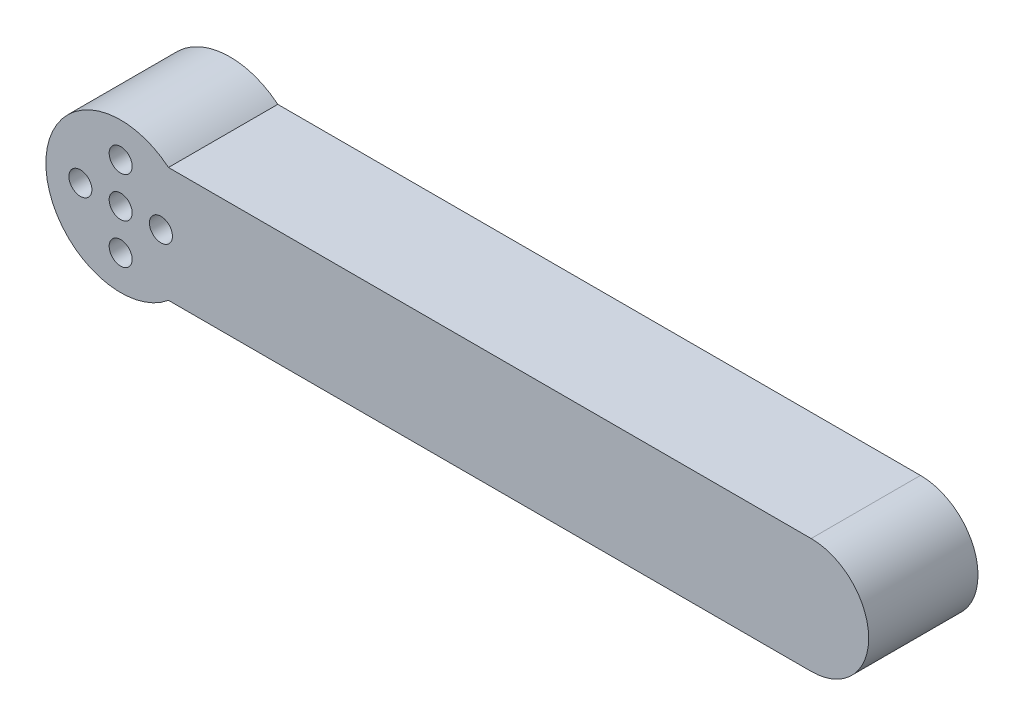
ISO-10303-21;
HEADER;
FILE_DESCRIPTION(('STEP AP214'),'2;1');
FILE_NAME('part.step','',(''),(''),'','','');
FILE_SCHEMA(('AUTOMOTIVE_DESIGN { 1 0 10303 214 1 1 1 1 }'));
ENDSEC;
DATA;
#1=APPLICATION_CONTEXT('core data for automotive mechanical design processes');
#2=APPLICATION_PROTOCOL_DEFINITION('international standard','automotive_design',2000,#1);
#3=PRODUCT_CONTEXT('',#1,'mechanical');
#4=PRODUCT('Part','Part','',(#3));
#5=PRODUCT_RELATED_PRODUCT_CATEGORY('part','',(#4));
#6=PRODUCT_DEFINITION_FORMATION('','',#4);
#7=PRODUCT_DEFINITION_CONTEXT('part definition',#1,'design');
#8=PRODUCT_DEFINITION('design','',#6,#7);
#9=PRODUCT_DEFINITION_SHAPE('','',#8);
#10=(LENGTH_UNIT() NAMED_UNIT(*) SI_UNIT(.MILLI.,.METRE.));
#11=(NAMED_UNIT(*) PLANE_ANGLE_UNIT() SI_UNIT($,.RADIAN.));
#12=(NAMED_UNIT(*) SI_UNIT($,.STERADIAN.) SOLID_ANGLE_UNIT());
#13=UNCERTAINTY_MEASURE_WITH_UNIT(LENGTH_MEASURE(1.E-05),#10,'distance_accuracy_value','');
#14=(GEOMETRIC_REPRESENTATION_CONTEXT(3) GLOBAL_UNCERTAINTY_ASSIGNED_CONTEXT((#13)) GLOBAL_UNIT_ASSIGNED_CONTEXT((#10,
#11,#12)) REPRESENTATION_CONTEXT('',''));
#15=CARTESIAN_POINT('',(0.,0.,0.));
#16=DIRECTION('',(0.,0.,1.));
#17=DIRECTION('',(1.,0.,0.));
#18=AXIS2_PLACEMENT_3D('',#15,#16,#17);
#19=CARTESIAN_POINT('',(0.,0.,0.));
#20=DIRECTION('',(0.,0.,1.));
#21=DIRECTION('',(1.,0.,0.));
#22=AXIS2_PLACEMENT_3D('',#19,#20,#21);
#23=PLANE('',#22);
#24=CARTESIAN_POINT('',(0.,0.,0.));
#25=DIRECTION('',(0.,0.,1.));
#26=DIRECTION('',(1.,0.,0.));
#27=AXIS2_PLACEMENT_3D('',#24,#25,#26);
#28=CIRCLE('',#27,13.);
#29=CARTESIAN_POINT('',(8.30662386291808,10.,0.));
#30=VERTEX_POINT('',#29);
#31=CARTESIAN_POINT('',(8.30662386291808,-10.,0.));
#32=VERTEX_POINT('',#31);
#33=EDGE_CURVE('E53',#30,#32,#28,.T.);
#34=ORIENTED_EDGE('',*,*,#33,.F.);
#35=DIRECTION('',(-1.,0.,0.));
#36=VECTOR('',#35,1.);
#37=CARTESIAN_POINT('',(0.,10.,0.));
#38=LINE('',#37,#36);
#39=CARTESIAN_POINT('',(120.,10.,0.));
#40=VERTEX_POINT('',#39);
#41=EDGE_CURVE('E95',#40,#30,#38,.T.);
#42=ORIENTED_EDGE('',*,*,#41,.F.);
#43=CARTESIAN_POINT('',(120.,0.,0.));
#44=DIRECTION('',(0.,0.,1.));
#45=DIRECTION('',(1.,0.,0.));
#46=AXIS2_PLACEMENT_3D('',#43,#44,#45);
#47=CIRCLE('',#46,10.);
#48=CARTESIAN_POINT('',(120.,-10.,0.));
#49=VERTEX_POINT('',#48);
#50=EDGE_CURVE('E120',#49,#40,#47,.T.);
#51=ORIENTED_EDGE('',*,*,#50,.F.);
#52=DIRECTION('',(1.,0.,0.));
#53=VECTOR('',#52,1.);
#54=CARTESIAN_POINT('',(0.,-10.,0.));
#55=LINE('',#54,#53);
#56=EDGE_CURVE('E98',#32,#49,#55,.T.);
#57=ORIENTED_EDGE('',*,*,#56,.F.);
#58=EDGE_LOOP('',(#34,#42,#51,#57));
#59=FACE_BOUND('',#58,.T.);
#60=CARTESIAN_POINT('',(0.,0.,-1.2E-05));
#61=DIRECTION('',(0.,0.,-1.));
#62=DIRECTION('',(-1.,0.,0.));
#63=AXIS2_PLACEMENT_3D('',#60,#61,#62);
#64=CIRCLE('',#63,10.1);
#65=CARTESIAN_POINT('',(-10.1,0.,-1.2E-05));
#66=VERTEX_POINT('',#65);
#67=EDGE_CURVE('E117',#66,#66,#64,.T.);
#68=ORIENTED_EDGE('',*,*,#67,.F.);
#69=EDGE_LOOP('',(#68));
#70=FACE_BOUND('',#69,.T.);
#71=ADVANCED_FACE('F42',(#59,#70),#23,.F.);
#72=CARTESIAN_POINT('',(0.,0.,19.));
#73=DIRECTION('',(0.,0.,-1.));
#74=DIRECTION('',(-1.,0.,0.));
#75=AXIS2_PLACEMENT_3D('',#72,#73,#74);
#76=CYLINDRICAL_SURFACE('',#75,13.);
#77=DIRECTION('',(0.,0.,-1.));
#78=VECTOR('',#77,1.);
#79=CARTESIAN_POINT('',(8.30662386291808,-10.,19.));
#80=LINE('',#79,#78);
#81=CARTESIAN_POINT('',(8.30662386291808,-10.,19.));
#82=VERTEX_POINT('',#81);
#83=EDGE_CURVE('E65',#82,#32,#80,.T.);
#84=ORIENTED_EDGE('',*,*,#83,.F.);
#85=CARTESIAN_POINT('',(0.,0.,19.));
#86=DIRECTION('',(0.,0.,1.));
#87=DIRECTION('',(1.,0.,0.));
#88=AXIS2_PLACEMENT_3D('',#85,#86,#87);
#89=CIRCLE('',#88,13.);
#90=CARTESIAN_POINT('',(8.30662386291808,10.,19.));
#91=VERTEX_POINT('',#90);
#92=EDGE_CURVE('E11',#91,#82,#89,.T.);
#93=ORIENTED_EDGE('',*,*,#92,.F.);
#94=DIRECTION('',(0.,0.,-1.));
#95=VECTOR('',#94,1.);
#96=CARTESIAN_POINT('',(8.30662386291808,10.,19.));
#97=LINE('',#96,#95);
#98=EDGE_CURVE('E105',#30,#91,#97,.F.);
#99=ORIENTED_EDGE('',*,*,#98,.F.);
#100=ORIENTED_EDGE('',*,*,#33,.T.);
#101=EDGE_LOOP('',(#84,#93,#99,#100));
#102=FACE_BOUND('',#101,.T.);
#103=ADVANCED_FACE('F46',(#102),#76,.T.);
#104=CARTESIAN_POINT('',(0.,0.,19.));
#105=DIRECTION('',(0.,0.,1.));
#106=DIRECTION('',(1.,0.,0.));
#107=AXIS2_PLACEMENT_3D('',#104,#105,#106);
#108=PLANE('',#107);
#109=CARTESIAN_POINT('',(0.,7.,19.));
#110=DIRECTION('',(0.,0.,1.));
#111=DIRECTION('',(0.,1.,0.));
#112=AXIS2_PLACEMENT_3D('',#109,#110,#111);
#113=CIRCLE('',#112,2.);
#114=CARTESIAN_POINT('',(1.99999999999997,7.,19.));
#115=VERTEX_POINT('',#114);
#116=EDGE_CURVE('E230',#115,#115,#113,.T.);
#117=ORIENTED_EDGE('',*,*,#116,.F.);
#118=EDGE_LOOP('',(#117));
#119=FACE_BOUND('',#118,.T.);
#120=CARTESIAN_POINT('',(-7.,0.,19.));
#121=DIRECTION('',(0.,0.,1.));
#122=DIRECTION('',(-1.,0.,0.));
#123=AXIS2_PLACEMENT_3D('',#120,#121,#122);
#124=CIRCLE('',#123,2.);
#125=CARTESIAN_POINT('',(-5.,0.,19.));
#126=VERTEX_POINT('',#125);
#127=EDGE_CURVE('E218',#126,#126,#124,.T.);
#128=ORIENTED_EDGE('',*,*,#127,.F.);
#129=EDGE_LOOP('',(#128));
#130=FACE_BOUND('',#129,.T.);
#131=CARTESIAN_POINT('',(0.,-7.,19.));
#132=DIRECTION('',(0.,0.,1.));
#133=DIRECTION('',(0.,-1.,0.));
#134=AXIS2_PLACEMENT_3D('',#131,#132,#133);
#135=CIRCLE('',#134,2.);
#136=CARTESIAN_POINT('',(2.00000000000007,-7.,19.));
#137=VERTEX_POINT('',#136);
#138=EDGE_CURVE('E211',#137,#137,#135,.T.);
#139=ORIENTED_EDGE('',*,*,#138,.F.);
#140=EDGE_LOOP('',(#139));
#141=FACE_BOUND('',#140,.T.);
#142=CARTESIAN_POINT('',(7.,0.,19.));
#143=DIRECTION('',(0.,0.,1.));
#144=DIRECTION('',(1.,0.,0.));
#145=AXIS2_PLACEMENT_3D('',#142,#143,#144);
#146=CIRCLE('',#145,2.);
#147=CARTESIAN_POINT('',(9.,0.,19.));
#148=VERTEX_POINT('',#147);
#149=EDGE_CURVE('E200',#148,#148,#146,.T.);
#150=ORIENTED_EDGE('',*,*,#149,.F.);
#151=EDGE_LOOP('',(#150));
#152=FACE_BOUND('',#151,.T.);
#153=CARTESIAN_POINT('',(0.,0.,19.));
#154=DIRECTION('',(0.,0.,1.));
#155=DIRECTION('',(1.,0.,0.));
#156=AXIS2_PLACEMENT_3D('',#153,#154,#155);
#157=CIRCLE('',#156,2.);
#158=CARTESIAN_POINT('',(2.,0.,19.));
#159=VERTEX_POINT('',#158);
#160=EDGE_CURVE('E193',#159,#159,#157,.T.);
#161=ORIENTED_EDGE('',*,*,#160,.F.);
#162=EDGE_LOOP('',(#161));
#163=FACE_BOUND('',#162,.T.);
#164=ORIENTED_EDGE('',*,*,#92,.T.);
#165=DIRECTION('',(1.,0.,0.));
#166=VECTOR('',#165,1.);
#167=CARTESIAN_POINT('',(0.,-10.,19.));
#168=LINE('',#167,#166);
#169=CARTESIAN_POINT('',(120.,-10.,19.));
#170=VERTEX_POINT('',#169);
#171=EDGE_CURVE('E81',#82,#170,#168,.T.);
#172=ORIENTED_EDGE('',*,*,#171,.T.);
#173=CARTESIAN_POINT('',(120.,0.,19.));
#174=DIRECTION('',(0.,0.,1.));
#175=DIRECTION('',(1.,0.,0.));
#176=AXIS2_PLACEMENT_3D('',#173,#174,#175);
#177=CIRCLE('',#176,10.);
#178=CARTESIAN_POINT('',(120.,10.,19.));
#179=VERTEX_POINT('',#178);
#180=EDGE_CURVE('E86',#170,#179,#177,.T.);
#181=ORIENTED_EDGE('',*,*,#180,.T.);
#182=DIRECTION('',(-1.,0.,0.));
#183=VECTOR('',#182,1.);
#184=CARTESIAN_POINT('',(0.,10.,19.));
#185=LINE('',#184,#183);
#186=EDGE_CURVE('E108',#179,#91,#185,.T.);
#187=ORIENTED_EDGE('',*,*,#186,.T.);
#188=EDGE_LOOP('',(#164,#172,#181,#187));
#189=FACE_BOUND('',#188,.T.);
#190=ADVANCED_FACE('F82',(#119,#130,#141,#152,#163,#189),#108,.T.);
#191=CARTESIAN_POINT('',(0.,-10.,19.));
#192=DIRECTION('',(0.,1.,0.));
#193=DIRECTION('',(0.,0.,1.));
#194=AXIS2_PLACEMENT_3D('',#191,#192,#193);
#195=PLANE('',#194);
#196=ORIENTED_EDGE('',*,*,#171,.F.);
#197=ORIENTED_EDGE('',*,*,#83,.T.);
#198=ORIENTED_EDGE('',*,*,#56,.T.);
#199=DIRECTION('',(0.,0.,-1.));
#200=VECTOR('',#199,1.);
#201=CARTESIAN_POINT('',(120.,-10.,19.));
#202=LINE('',#201,#200);
#203=EDGE_CURVE('E92',#170,#49,#202,.T.);
#204=ORIENTED_EDGE('',*,*,#203,.F.);
#205=EDGE_LOOP('',(#196,#197,#198,#204));
#206=FACE_BOUND('',#205,.T.);
#207=ADVANCED_FACE('F96',(#206),#195,.F.);
#208=CARTESIAN_POINT('',(0.,10.,19.));
#209=DIRECTION('',(0.,-1.,0.));
#210=DIRECTION('',(0.,0.,-1.));
#211=AXIS2_PLACEMENT_3D('',#208,#209,#210);
#212=PLANE('',#211);
#213=ORIENTED_EDGE('',*,*,#41,.T.);
#214=ORIENTED_EDGE('',*,*,#98,.T.);
#215=ORIENTED_EDGE('',*,*,#186,.F.);
#216=DIRECTION('',(0.,0.,-1.));
#217=VECTOR('',#216,1.);
#218=CARTESIAN_POINT('',(120.,10.,19.));
#219=LINE('',#218,#217);
#220=EDGE_CURVE('E103',#179,#40,#219,.T.);
#221=ORIENTED_EDGE('',*,*,#220,.T.);
#222=EDGE_LOOP('',(#213,#214,#215,#221));
#223=FACE_BOUND('',#222,.T.);
#224=ADVANCED_FACE('F156',(#223),#212,.F.);
#225=CARTESIAN_POINT('',(120.,0.,19.));
#226=DIRECTION('',(0.,0.,-1.));
#227=DIRECTION('',(-1.,0.,0.));
#228=AXIS2_PLACEMENT_3D('',#225,#226,#227);
#229=CYLINDRICAL_SURFACE('',#228,10.);
#230=ORIENTED_EDGE('',*,*,#50,.T.);
#231=ORIENTED_EDGE('',*,*,#220,.F.);
#232=ORIENTED_EDGE('',*,*,#180,.F.);
#233=ORIENTED_EDGE('',*,*,#203,.T.);
#234=EDGE_LOOP('',(#230,#231,#232,#233));
#235=FACE_BOUND('',#234,.T.);
#236=ADVANCED_FACE('F104',(#235),#229,.T.);
#237=CARTESIAN_POINT('',(0.,0.,-1.2E-05));
#238=DIRECTION('',(0.,0.,1.));
#239=DIRECTION('',(1.,0.,0.));
#240=AXIS2_PLACEMENT_3D('',#237,#238,#239);
#241=CYLINDRICAL_SURFACE('',#240,10.1);
#242=ORIENTED_EDGE('',*,*,#67,.T.);
#243=EDGE_LOOP('',(#242));
#244=FACE_BOUND('',#243,.T.);
#245=CARTESIAN_POINT('',(0.,0.,4.));
#246=DIRECTION('',(0.,0.,-1.));
#247=DIRECTION('',(-1.,0.,0.));
#248=AXIS2_PLACEMENT_3D('',#245,#246,#247);
#249=CIRCLE('',#248,10.1);
#250=CARTESIAN_POINT('',(-10.1,0.,4.));
#251=VERTEX_POINT('',#250);
#252=EDGE_CURVE('E176',#251,#251,#249,.T.);
#253=ORIENTED_EDGE('',*,*,#252,.F.);
#254=EDGE_LOOP('',(#253));
#255=FACE_BOUND('',#254,.T.);
#256=ADVANCED_FACE('F157',(#244,#255),#241,.F.);
#257=CARTESIAN_POINT('',(0.,0.,4.));
#258=DIRECTION('',(0.,0.,-1.));
#259=DIRECTION('',(-1.,0.,0.));
#260=AXIS2_PLACEMENT_3D('',#257,#258,#259);
#261=PLANE('',#260);
#262=CARTESIAN_POINT('',(0.,7.,4.));
#263=DIRECTION('',(0.,0.,-1.));
#264=DIRECTION('',(0.,-1.,0.));
#265=AXIS2_PLACEMENT_3D('',#262,#263,#264);
#266=CIRCLE('',#265,1.1);
#267=CARTESIAN_POINT('',(0.,5.9,4.));
#268=VERTEX_POINT('',#267);
#269=EDGE_CURVE('E245',#268,#268,#266,.T.);
#270=ORIENTED_EDGE('',*,*,#269,.F.);
#271=EDGE_LOOP('',(#270));
#272=FACE_BOUND('',#271,.T.);
#273=CARTESIAN_POINT('',(-7.,0.,4.));
#274=DIRECTION('',(0.,0.,-1.));
#275=DIRECTION('',(1.,0.,0.));
#276=AXIS2_PLACEMENT_3D('',#273,#274,#275);
#277=CIRCLE('',#276,1.1);
#278=CARTESIAN_POINT('',(-5.9,0.,4.));
#279=VERTEX_POINT('',#278);
#280=EDGE_CURVE('E236',#279,#279,#277,.T.);
#281=ORIENTED_EDGE('',*,*,#280,.F.);
#282=EDGE_LOOP('',(#281));
#283=FACE_BOUND('',#282,.T.);
#284=CARTESIAN_POINT('',(0.,-7.,4.));
#285=DIRECTION('',(0.,0.,-1.));
#286=DIRECTION('',(0.,1.,0.));
#287=AXIS2_PLACEMENT_3D('',#284,#285,#286);
#288=CIRCLE('',#287,1.1);
#289=CARTESIAN_POINT('',(0.,-5.9,4.));
#290=VERTEX_POINT('',#289);
#291=EDGE_CURVE('E234',#290,#290,#288,.T.);
#292=ORIENTED_EDGE('',*,*,#291,.F.);
#293=EDGE_LOOP('',(#292));
#294=FACE_BOUND('',#293,.T.);
#295=CARTESIAN_POINT('',(7.,0.,4.));
#296=DIRECTION('',(0.,0.,-1.));
#297=DIRECTION('',(-1.,0.,0.));
#298=AXIS2_PLACEMENT_3D('',#295,#296,#297);
#299=CIRCLE('',#298,1.1);
#300=CARTESIAN_POINT('',(5.9,0.,4.));
#301=VERTEX_POINT('',#300);
#302=EDGE_CURVE('E206',#301,#301,#299,.T.);
#303=ORIENTED_EDGE('',*,*,#302,.F.);
#304=EDGE_LOOP('',(#303));
#305=FACE_BOUND('',#304,.T.);
#306=CARTESIAN_POINT('',(0.,0.,4.));
#307=DIRECTION('',(0.,0.,-1.));
#308=DIRECTION('',(-1.,0.,0.));
#309=AXIS2_PLACEMENT_3D('',#306,#307,#308);
#310=CIRCLE('',#309,4.25);
#311=CARTESIAN_POINT('',(-4.25,0.,4.));
#312=VERTEX_POINT('',#311);
#313=EDGE_CURVE('E181',#312,#312,#310,.T.);
#314=ORIENTED_EDGE('',*,*,#313,.F.);
#315=EDGE_LOOP('',(#314));
#316=FACE_BOUND('',#315,.T.);
#317=ORIENTED_EDGE('',*,*,#252,.T.);
#318=EDGE_LOOP('',(#317));
#319=FACE_BOUND('',#318,.T.);
#320=ADVANCED_FACE('F167',(#272,#283,#294,#305,#316,#319),#261,.T.);
#321=CARTESIAN_POINT('',(0.,0.,6.6));
#322=DIRECTION('',(0.,0.,-1.));
#323=DIRECTION('',(-1.,0.,0.));
#324=AXIS2_PLACEMENT_3D('',#321,#322,#323);
#325=CYLINDRICAL_SURFACE('',#324,4.25);
#326=CARTESIAN_POINT('',(0.,0.,6.6));
#327=DIRECTION('',(0.,0.,-1.));
#328=DIRECTION('',(-1.,0.,0.));
#329=AXIS2_PLACEMENT_3D('',#326,#327,#328);
#330=CIRCLE('',#329,4.25);
#331=CARTESIAN_POINT('',(-4.25,0.,6.6));
#332=VERTEX_POINT('',#331);
#333=EDGE_CURVE('E185',#332,#332,#330,.T.);
#334=ORIENTED_EDGE('',*,*,#333,.F.);
#335=EDGE_LOOP('',(#334));
#336=FACE_BOUND('',#335,.T.);
#337=ORIENTED_EDGE('',*,*,#313,.T.);
#338=EDGE_LOOP('',(#337));
#339=FACE_BOUND('',#338,.T.);
#340=ADVANCED_FACE('F296',(#336,#339),#325,.F.);
#341=CARTESIAN_POINT('',(0.,0.,6.6));
#342=DIRECTION('',(0.,0.,-1.));
#343=DIRECTION('',(-1.,0.,0.));
#344=AXIS2_PLACEMENT_3D('',#341,#342,#343);
#345=PLANE('',#344);
#346=ORIENTED_EDGE('',*,*,#333,.T.);
#347=EDGE_LOOP('',(#346));
#348=FACE_BOUND('',#347,.T.);
#349=ADVANCED_FACE('F288',(#348),#345,.T.);
#350=CARTESIAN_POINT('',(0.,0.,9.));
#351=DIRECTION('',(0.,0.,1.));
#352=DIRECTION('',(1.,0.,0.));
#353=AXIS2_PLACEMENT_3D('',#350,#351,#352);
#354=CYLINDRICAL_SURFACE('',#353,2.);
#355=CARTESIAN_POINT('',(0.,0.,9.));
#356=DIRECTION('',(0.,0.,1.));
#357=DIRECTION('',(1.,0.,0.));
#358=AXIS2_PLACEMENT_3D('',#355,#356,#357);
#359=CIRCLE('',#358,2.);
#360=CARTESIAN_POINT('',(2.,0.,9.));
#361=VERTEX_POINT('',#360);
#362=EDGE_CURVE('E190',#361,#361,#359,.T.);
#363=ORIENTED_EDGE('',*,*,#362,.F.);
#364=EDGE_LOOP('',(#363));
#365=FACE_BOUND('',#364,.T.);
#366=ORIENTED_EDGE('',*,*,#160,.T.);
#367=EDGE_LOOP('',(#366));
#368=FACE_BOUND('',#367,.T.);
#369=ADVANCED_FACE('F282',(#365,#368),#354,.F.);
#370=CARTESIAN_POINT('',(0.,0.,9.));
#371=DIRECTION('',(0.,0.,1.));
#372=DIRECTION('',(1.,0.,0.));
#373=AXIS2_PLACEMENT_3D('',#370,#371,#372);
#374=PLANE('',#373);
#375=ORIENTED_EDGE('',*,*,#362,.T.);
#376=EDGE_LOOP('',(#375));
#377=FACE_BOUND('',#376,.T.);
#378=ADVANCED_FACE('F284',(#377),#374,.T.);
#379=CARTESIAN_POINT('',(7.,0.,6.));
#380=DIRECTION('',(0.,0.,1.));
#381=DIRECTION('',(1.,0.,0.));
#382=AXIS2_PLACEMENT_3D('',#379,#380,#381);
#383=CYLINDRICAL_SURFACE('',#382,2.);
#384=CARTESIAN_POINT('',(7.,0.,6.));
#385=DIRECTION('',(0.,0.,1.));
#386=DIRECTION('',(1.,0.,0.));
#387=AXIS2_PLACEMENT_3D('',#384,#385,#386);
#388=CIRCLE('',#387,2.);
#389=CARTESIAN_POINT('',(9.,0.,6.));
#390=VERTEX_POINT('',#389);
#391=EDGE_CURVE('E192',#390,#390,#388,.T.);
#392=CARTESIAN_POINT('',(9.,0.,6.));
#393=CARTESIAN_POINT('',(9.,0.,6.13541666666667));
#394=CARTESIAN_POINT('',(9.,0.,6.27083333333333));
#395=CARTESIAN_POINT('',(9.,0.,6.54166666666667));
#396=CARTESIAN_POINT('',(9.,0.,6.67708333333333));
#397=CARTESIAN_POINT('',(9.,0.,6.94791666666667));
#398=CARTESIAN_POINT('',(9.,0.,7.08333333333333));
#399=CARTESIAN_POINT('',(9.,0.,7.35416666666667));
#400=CARTESIAN_POINT('',(9.,0.,7.48958333333333));
#401=CARTESIAN_POINT('',(9.,0.,7.76041666666667));
#402=CARTESIAN_POINT('',(9.,0.,7.89583333333333));
#403=CARTESIAN_POINT('',(9.,0.,8.16666666666667));
#404=CARTESIAN_POINT('',(9.,0.,8.30208333333333));
#405=CARTESIAN_POINT('',(9.,0.,8.57291666666667));
#406=CARTESIAN_POINT('',(9.,0.,8.70833333333333));
#407=CARTESIAN_POINT('',(9.,0.,8.97916666666667));
#408=CARTESIAN_POINT('',(9.,0.,9.11458333333333));
#409=CARTESIAN_POINT('',(9.,0.,9.38541666666667));
#410=CARTESIAN_POINT('',(9.,0.,9.52083333333333));
#411=CARTESIAN_POINT('',(9.,0.,9.79166666666667));
#412=CARTESIAN_POINT('',(9.,0.,9.92708333333333));
#413=CARTESIAN_POINT('',(9.,0.,10.1979166666667));
#414=CARTESIAN_POINT('',(9.,0.,10.3333333333333));
#415=CARTESIAN_POINT('',(9.,0.,10.6041666666667));
#416=CARTESIAN_POINT('',(9.,0.,10.7395833333333));
#417=CARTESIAN_POINT('',(9.,0.,11.0104166666667));
#418=CARTESIAN_POINT('',(9.,0.,11.1458333333333));
#419=CARTESIAN_POINT('',(9.,0.,11.4166666666667));
#420=CARTESIAN_POINT('',(9.,0.,11.5520833333333));
#421=CARTESIAN_POINT('',(9.,0.,11.8229166666667));
#422=CARTESIAN_POINT('',(9.,0.,11.9583333333333));
#423=CARTESIAN_POINT('',(9.,0.,12.2291666666667));
#424=CARTESIAN_POINT('',(9.,0.,12.3645833333333));
#425=CARTESIAN_POINT('',(9.,0.,12.6354166666667));
#426=CARTESIAN_POINT('',(9.,0.,12.7708333333333));
#427=CARTESIAN_POINT('',(9.,0.,13.0416666666667));
#428=CARTESIAN_POINT('',(9.,0.,13.1770833333333));
#429=CARTESIAN_POINT('',(9.,0.,13.4479166666667));
#430=CARTESIAN_POINT('',(9.,0.,13.5833333333333));
#431=CARTESIAN_POINT('',(9.,0.,13.8541666666667));
#432=CARTESIAN_POINT('',(9.,0.,13.9895833333333));
#433=CARTESIAN_POINT('',(9.,0.,14.2604166666667));
#434=CARTESIAN_POINT('',(9.,0.,14.3958333333333));
#435=CARTESIAN_POINT('',(9.,0.,14.6666666666667));
#436=CARTESIAN_POINT('',(9.,0.,14.8020833333333));
#437=CARTESIAN_POINT('',(9.,0.,15.0729166666667));
#438=CARTESIAN_POINT('',(9.,0.,15.2083333333333));
#439=CARTESIAN_POINT('',(9.,0.,15.4791666666667));
#440=CARTESIAN_POINT('',(9.,0.,15.6145833333333));
#441=CARTESIAN_POINT('',(9.,0.,15.8854166666667));
#442=CARTESIAN_POINT('',(9.,0.,16.0208333333333));
#443=CARTESIAN_POINT('',(9.,0.,16.2916666666667));
#444=CARTESIAN_POINT('',(9.,0.,16.4270833333333));
#445=CARTESIAN_POINT('',(9.,0.,16.6979166666667));
#446=CARTESIAN_POINT('',(9.,0.,16.8333333333333));
#447=CARTESIAN_POINT('',(9.,0.,17.1041666666667));
#448=CARTESIAN_POINT('',(9.,0.,17.2395833333333));
#449=CARTESIAN_POINT('',(9.,0.,17.5104166666667));
#450=CARTESIAN_POINT('',(9.,0.,17.6458333333333));
#451=CARTESIAN_POINT('',(9.,0.,17.9166666666667));
#452=CARTESIAN_POINT('',(9.,0.,18.0520833333333));
#453=CARTESIAN_POINT('',(9.,0.,18.3229166666667));
#454=CARTESIAN_POINT('',(9.,0.,18.4583333333333));
#455=CARTESIAN_POINT('',(9.,0.,18.7291666666667));
#456=CARTESIAN_POINT('',(9.,0.,18.8645833333333));
#457=CARTESIAN_POINT('',(9.,0.,19.));
#458=B_SPLINE_CURVE_WITH_KNOTS('',3,(#392,#393,#394,#395,#396,#397,#398,#399,#400,#401,#402,
#403,#404,#405,#406,#407,#408,#409,#410,#411,#412,#413,#414,#415,#416,#417,#418,#419,#420,#421,
#422,#423,#424,#425,#426,#427,#428,#429,#430,#431,#432,#433,#434,#435,#436,#437,#438,#439,#440,
#441,#442,#443,#444,#445,#446,#447,#448,#449,#450,#451,#452,#453,#454,#455,#456,#457),
.UNSPECIFIED.,.F.,.F.,(4,2,2,2,2,2,2,2,2,2,2,2,2,2,2,2,2,2,2,2,2,2,2,2,2,2,2,2,2,2,2,2,4),(0.,
0.40625,0.812500000000001,1.21875,1.625,2.03125,2.4375,2.84375,3.25,3.65625,4.0625,4.46875,
4.875,5.28125,5.6875,6.09375,6.5,6.90625,7.3125,7.71875,8.125,8.53125,8.9375,9.34375,9.75,
10.15625,10.5625,10.96875,11.375,11.78125,12.1875,12.59375,13.),.UNSPECIFIED.);
#459=EDGE_CURVE('BSEAM291',#390,#148,#458,.T.);
#460=ORIENTED_EDGE('',*,*,#391,.F.);
#461=ORIENTED_EDGE('',*,*,#149,.T.);
#462=ORIENTED_EDGE('',*,*,#459,.T.);
#463=ORIENTED_EDGE('',*,*,#459,.F.);
#464=EDGE_LOOP('',(#460,#462,#461,#463));
#465=FACE_BOUND('',#464,.T.);
#466=ADVANCED_FACE('F291',(#465),#383,.F.);
#467=CARTESIAN_POINT('',(7.,0.,6.));
#468=DIRECTION('',(0.,0.,1.));
#469=DIRECTION('',(1.,0.,0.));
#470=AXIS2_PLACEMENT_3D('',#467,#468,#469);
#471=PLANE('',#470);
#472=CARTESIAN_POINT('',(7.,0.,6.));
#473=DIRECTION('',(0.,0.,1.));
#474=DIRECTION('',(1.,0.,0.));
#475=AXIS2_PLACEMENT_3D('',#472,#473,#474);
#476=CIRCLE('',#475,1.1);
#477=CARTESIAN_POINT('',(8.1,0.,6.));
#478=VERTEX_POINT('',#477);
#479=EDGE_CURVE('E137',#478,#478,#476,.T.);
#480=ORIENTED_EDGE('',*,*,#479,.F.);
#481=EDGE_LOOP('',(#480));
#482=FACE_BOUND('',#481,.T.);
#483=ORIENTED_EDGE('',*,*,#391,.T.);
#484=EDGE_LOOP('',(#483));
#485=FACE_BOUND('',#484,.T.);
#486=ADVANCED_FACE('F322',(#482,#485),#471,.T.);
#487=CARTESIAN_POINT('',(7.,0.,19.));
#488=DIRECTION('',(0.,0.,-1.));
#489=DIRECTION('',(-1.,0.,0.));
#490=AXIS2_PLACEMENT_3D('',#487,#488,#489);
#491=CYLINDRICAL_SURFACE('',#490,1.1);
#492=ORIENTED_EDGE('',*,*,#479,.T.);
#493=EDGE_LOOP('',(#492));
#494=FACE_BOUND('',#493,.T.);
#495=ORIENTED_EDGE('',*,*,#302,.T.);
#496=EDGE_LOOP('',(#495));
#497=FACE_BOUND('',#496,.T.);
#498=ADVANCED_FACE('F273',(#494,#497),#491,.F.);
#499=CARTESIAN_POINT('',(0.,-7.,6.));
#500=DIRECTION('',(0.,0.,1.));
#501=DIRECTION('',(1.,0.,0.));
#502=AXIS2_PLACEMENT_3D('',#499,#500,#501);
#503=CYLINDRICAL_SURFACE('',#502,2.);
#504=CARTESIAN_POINT('',(0.,-7.,6.));
#505=DIRECTION('',(0.,0.,1.));
#506=DIRECTION('',(0.,-1.,0.));
#507=AXIS2_PLACEMENT_3D('',#504,#505,#506);
#508=CIRCLE('',#507,2.);
#509=CARTESIAN_POINT('',(2.00000000000007,-7.,6.));
#510=VERTEX_POINT('',#509);
#511=EDGE_CURVE('E214',#510,#510,#508,.T.);
#512=CARTESIAN_POINT('',(2.00000000000007,-7.,6.));
#513=CARTESIAN_POINT('',(2.00000000000007,-7.,6.13541666666667));
#514=CARTESIAN_POINT('',(2.00000000000007,-7.,6.27083333333333));
#515=CARTESIAN_POINT('',(2.00000000000007,-7.,6.54166666666667));
#516=CARTESIAN_POINT('',(2.00000000000007,-7.,6.67708333333333));
#517=CARTESIAN_POINT('',(2.00000000000007,-7.,6.94791666666667));
#518=CARTESIAN_POINT('',(2.00000000000007,-7.,7.08333333333333));
#519=CARTESIAN_POINT('',(2.00000000000007,-7.,7.35416666666667));
#520=CARTESIAN_POINT('',(2.00000000000007,-7.,7.48958333333333));
#521=CARTESIAN_POINT('',(2.00000000000007,-7.,7.76041666666667));
#522=CARTESIAN_POINT('',(2.00000000000007,-7.,7.89583333333333));
#523=CARTESIAN_POINT('',(2.00000000000007,-7.,8.16666666666667));
#524=CARTESIAN_POINT('',(2.00000000000007,-7.,8.30208333333333));
#525=CARTESIAN_POINT('',(2.00000000000007,-7.,8.57291666666667));
#526=CARTESIAN_POINT('',(2.00000000000007,-7.,8.70833333333333));
#527=CARTESIAN_POINT('',(2.00000000000007,-7.,8.97916666666667));
#528=CARTESIAN_POINT('',(2.00000000000007,-7.,9.11458333333333));
#529=CARTESIAN_POINT('',(2.00000000000007,-7.,9.38541666666667));
#530=CARTESIAN_POINT('',(2.00000000000007,-7.,9.52083333333333));
#531=CARTESIAN_POINT('',(2.00000000000007,-7.,9.79166666666667));
#532=CARTESIAN_POINT('',(2.00000000000007,-7.,9.92708333333333));
#533=CARTESIAN_POINT('',(2.00000000000007,-7.,10.1979166666667));
#534=CARTESIAN_POINT('',(2.00000000000007,-7.,10.3333333333333));
#535=CARTESIAN_POINT('',(2.00000000000007,-7.,10.6041666666667));
#536=CARTESIAN_POINT('',(2.00000000000007,-7.,10.7395833333333));
#537=CARTESIAN_POINT('',(2.00000000000007,-7.,11.0104166666667));
#538=CARTESIAN_POINT('',(2.00000000000007,-7.,11.1458333333333));
#539=CARTESIAN_POINT('',(2.00000000000007,-7.,11.4166666666667));
#540=CARTESIAN_POINT('',(2.00000000000007,-7.,11.5520833333333));
#541=CARTESIAN_POINT('',(2.00000000000007,-7.,11.8229166666667));
#542=CARTESIAN_POINT('',(2.00000000000007,-7.,11.9583333333333));
#543=CARTESIAN_POINT('',(2.00000000000007,-7.,12.2291666666667));
#544=CARTESIAN_POINT('',(2.00000000000007,-7.,12.3645833333333));
#545=CARTESIAN_POINT('',(2.00000000000007,-7.,12.6354166666667));
#546=CARTESIAN_POINT('',(2.00000000000007,-7.,12.7708333333333));
#547=CARTESIAN_POINT('',(2.00000000000007,-7.,13.0416666666667));
#548=CARTESIAN_POINT('',(2.00000000000007,-7.,13.1770833333333));
#549=CARTESIAN_POINT('',(2.00000000000007,-7.,13.4479166666667));
#550=CARTESIAN_POINT('',(2.00000000000007,-7.,13.5833333333333));
#551=CARTESIAN_POINT('',(2.00000000000007,-7.,13.8541666666667));
#552=CARTESIAN_POINT('',(2.00000000000007,-7.,13.9895833333333));
#553=CARTESIAN_POINT('',(2.00000000000007,-7.,14.2604166666667));
#554=CARTESIAN_POINT('',(2.00000000000007,-7.,14.3958333333333));
#555=CARTESIAN_POINT('',(2.00000000000007,-7.,14.6666666666667));
#556=CARTESIAN_POINT('',(2.00000000000007,-7.,14.8020833333333));
#557=CARTESIAN_POINT('',(2.00000000000007,-7.,15.0729166666667));
#558=CARTESIAN_POINT('',(2.00000000000007,-7.,15.2083333333333));
#559=CARTESIAN_POINT('',(2.00000000000007,-7.,15.4791666666667));
#560=CARTESIAN_POINT('',(2.00000000000007,-7.,15.6145833333333));
#561=CARTESIAN_POINT('',(2.00000000000007,-7.,15.8854166666667));
#562=CARTESIAN_POINT('',(2.00000000000007,-7.,16.0208333333333));
#563=CARTESIAN_POINT('',(2.00000000000007,-7.,16.2916666666667));
#564=CARTESIAN_POINT('',(2.00000000000007,-7.,16.4270833333333));
#565=CARTESIAN_POINT('',(2.00000000000007,-7.,16.6979166666667));
#566=CARTESIAN_POINT('',(2.00000000000007,-7.,16.8333333333333));
#567=CARTESIAN_POINT('',(2.00000000000007,-7.,17.1041666666667));
#568=CARTESIAN_POINT('',(2.00000000000007,-7.,17.2395833333333));
#569=CARTESIAN_POINT('',(2.00000000000007,-7.,17.5104166666667));
#570=CARTESIAN_POINT('',(2.00000000000007,-7.,17.6458333333333));
#571=CARTESIAN_POINT('',(2.00000000000007,-7.,17.9166666666667));
#572=CARTESIAN_POINT('',(2.00000000000007,-7.,18.0520833333333));
#573=CARTESIAN_POINT('',(2.00000000000007,-7.,18.3229166666667));
#574=CARTESIAN_POINT('',(2.00000000000007,-7.,18.4583333333333));
#575=CARTESIAN_POINT('',(2.00000000000007,-7.,18.7291666666667));
#576=CARTESIAN_POINT('',(2.00000000000007,-7.,18.8645833333333));
#577=CARTESIAN_POINT('',(2.00000000000007,-7.,19.));
#578=B_SPLINE_CURVE_WITH_KNOTS('',3,(#512,#513,#514,#515,#516,#517,#518,#519,#520,#521,#522,
#523,#524,#525,#526,#527,#528,#529,#530,#531,#532,#533,#534,#535,#536,#537,#538,#539,#540,#541,
#542,#543,#544,#545,#546,#547,#548,#549,#550,#551,#552,#553,#554,#555,#556,#557,#558,#559,#560,
#561,#562,#563,#564,#565,#566,#567,#568,#569,#570,#571,#572,#573,#574,#575,#576,#577),
.UNSPECIFIED.,.F.,.F.,(4,2,2,2,2,2,2,2,2,2,2,2,2,2,2,2,2,2,2,2,2,2,2,2,2,2,2,2,2,2,2,2,4),(0.,
0.40625,0.812500000000001,1.21875,1.625,2.03125,2.4375,2.84375,3.25,3.65625,4.0625,4.46875,
4.875,5.28125,5.6875,6.09375,6.5,6.90625,7.3125,7.71875,8.125,8.53125,8.9375,9.34375,9.75,
10.15625,10.5625,10.96875,11.375,11.78125,12.1875,12.59375,13.),.UNSPECIFIED.);
#579=EDGE_CURVE('BSEAM268',#510,#137,#578,.T.);
#580=ORIENTED_EDGE('',*,*,#511,.F.);
#581=ORIENTED_EDGE('',*,*,#138,.T.);
#582=ORIENTED_EDGE('',*,*,#579,.T.);
#583=ORIENTED_EDGE('',*,*,#579,.F.);
#584=EDGE_LOOP('',(#580,#582,#581,#583));
#585=FACE_BOUND('',#584,.T.);
#586=ADVANCED_FACE('F268',(#585),#503,.F.);
#587=CARTESIAN_POINT('',(0.,-7.,6.));
#588=DIRECTION('',(0.,0.,1.));
#589=DIRECTION('',(0.,-1.,0.));
#590=AXIS2_PLACEMENT_3D('',#587,#588,#589);
#591=PLANE('',#590);
#592=CARTESIAN_POINT('',(0.,-7.,6.));
#593=DIRECTION('',(0.,0.,1.));
#594=DIRECTION('',(1.,0.,0.));
#595=AXIS2_PLACEMENT_3D('',#592,#593,#594);
#596=CIRCLE('',#595,1.1);
#597=CARTESIAN_POINT('',(1.10000000000007,-7.,6.));
#598=VERTEX_POINT('',#597);
#599=EDGE_CURVE('E48',#598,#598,#596,.T.);
#600=ORIENTED_EDGE('',*,*,#599,.F.);
#601=EDGE_LOOP('',(#600));
#602=FACE_BOUND('',#601,.T.);
#603=ORIENTED_EDGE('',*,*,#511,.T.);
#604=EDGE_LOOP('',(#603));
#605=FACE_BOUND('',#604,.T.);
#606=ADVANCED_FACE('F262',(#602,#605),#591,.T.);
#607=CARTESIAN_POINT('',(-7.,0.,6.));
#608=DIRECTION('',(0.,0.,1.));
#609=DIRECTION('',(1.,0.,0.));
#610=AXIS2_PLACEMENT_3D('',#607,#608,#609);
#611=CYLINDRICAL_SURFACE('',#610,2.);
#612=CARTESIAN_POINT('',(-7.,0.,6.));
#613=DIRECTION('',(0.,0.,1.));
#614=DIRECTION('',(-1.,0.,0.));
#615=AXIS2_PLACEMENT_3D('',#612,#613,#614);
#616=CIRCLE('',#615,2.);
#617=CARTESIAN_POINT('',(-5.,0.,6.));
#618=VERTEX_POINT('',#617);
#619=EDGE_CURVE('E224',#618,#618,#616,.T.);
#620=CARTESIAN_POINT('',(-5.,0.,6.));
#621=CARTESIAN_POINT('',(-5.,0.,6.13541666666667));
#622=CARTESIAN_POINT('',(-5.,0.,6.27083333333333));
#623=CARTESIAN_POINT('',(-5.,0.,6.54166666666667));
#624=CARTESIAN_POINT('',(-5.,0.,6.67708333333333));
#625=CARTESIAN_POINT('',(-5.,0.,6.94791666666667));
#626=CARTESIAN_POINT('',(-5.,0.,7.08333333333333));
#627=CARTESIAN_POINT('',(-5.,0.,7.35416666666667));
#628=CARTESIAN_POINT('',(-5.,0.,7.48958333333333));
#629=CARTESIAN_POINT('',(-5.,0.,7.76041666666667));
#630=CARTESIAN_POINT('',(-5.,0.,7.89583333333333));
#631=CARTESIAN_POINT('',(-5.,0.,8.16666666666667));
#632=CARTESIAN_POINT('',(-5.,0.,8.30208333333333));
#633=CARTESIAN_POINT('',(-5.,0.,8.57291666666667));
#634=CARTESIAN_POINT('',(-5.,0.,8.70833333333333));
#635=CARTESIAN_POINT('',(-5.,0.,8.97916666666667));
#636=CARTESIAN_POINT('',(-5.,0.,9.11458333333333));
#637=CARTESIAN_POINT('',(-5.,0.,9.38541666666667));
#638=CARTESIAN_POINT('',(-5.,0.,9.52083333333333));
#639=CARTESIAN_POINT('',(-5.,0.,9.79166666666667));
#640=CARTESIAN_POINT('',(-5.,0.,9.92708333333333));
#641=CARTESIAN_POINT('',(-5.,0.,10.1979166666667));
#642=CARTESIAN_POINT('',(-5.,0.,10.3333333333333));
#643=CARTESIAN_POINT('',(-5.,0.,10.6041666666667));
#644=CARTESIAN_POINT('',(-5.,0.,10.7395833333333));
#645=CARTESIAN_POINT('',(-5.,0.,11.0104166666667));
#646=CARTESIAN_POINT('',(-5.,0.,11.1458333333333));
#647=CARTESIAN_POINT('',(-5.,0.,11.4166666666667));
#648=CARTESIAN_POINT('',(-5.,0.,11.5520833333333));
#649=CARTESIAN_POINT('',(-5.,0.,11.8229166666667));
#650=CARTESIAN_POINT('',(-5.,0.,11.9583333333333));
#651=CARTESIAN_POINT('',(-5.,0.,12.2291666666667));
#652=CARTESIAN_POINT('',(-5.,0.,12.3645833333333));
#653=CARTESIAN_POINT('',(-5.,0.,12.6354166666667));
#654=CARTESIAN_POINT('',(-5.,0.,12.7708333333333));
#655=CARTESIAN_POINT('',(-5.,0.,13.0416666666667));
#656=CARTESIAN_POINT('',(-5.,0.,13.1770833333333));
#657=CARTESIAN_POINT('',(-5.,0.,13.4479166666667));
#658=CARTESIAN_POINT('',(-5.,0.,13.5833333333333));
#659=CARTESIAN_POINT('',(-5.,0.,13.8541666666667));
#660=CARTESIAN_POINT('',(-5.,0.,13.9895833333333));
#661=CARTESIAN_POINT('',(-5.,0.,14.2604166666667));
#662=CARTESIAN_POINT('',(-5.,0.,14.3958333333333));
#663=CARTESIAN_POINT('',(-5.,0.,14.6666666666667));
#664=CARTESIAN_POINT('',(-5.,0.,14.8020833333333));
#665=CARTESIAN_POINT('',(-5.,0.,15.0729166666667));
#666=CARTESIAN_POINT('',(-5.,0.,15.2083333333333));
#667=CARTESIAN_POINT('',(-5.,0.,15.4791666666667));
#668=CARTESIAN_POINT('',(-5.,0.,15.6145833333333));
#669=CARTESIAN_POINT('',(-5.,0.,15.8854166666667));
#670=CARTESIAN_POINT('',(-5.,0.,16.0208333333333));
#671=CARTESIAN_POINT('',(-5.,0.,16.2916666666667));
#672=CARTESIAN_POINT('',(-5.,0.,16.4270833333333));
#673=CARTESIAN_POINT('',(-5.,0.,16.6979166666667));
#674=CARTESIAN_POINT('',(-5.,0.,16.8333333333333));
#675=CARTESIAN_POINT('',(-5.,0.,17.1041666666667));
#676=CARTESIAN_POINT('',(-5.,0.,17.2395833333333));
#677=CARTESIAN_POINT('',(-5.,0.,17.5104166666667));
#678=CARTESIAN_POINT('',(-5.,0.,17.6458333333333));
#679=CARTESIAN_POINT('',(-5.,0.,17.9166666666667));
#680=CARTESIAN_POINT('',(-5.,0.,18.0520833333333));
#681=CARTESIAN_POINT('',(-5.,0.,18.3229166666667));
#682=CARTESIAN_POINT('',(-5.,0.,18.4583333333333));
#683=CARTESIAN_POINT('',(-5.,0.,18.7291666666667));
#684=CARTESIAN_POINT('',(-5.,0.,18.8645833333333));
#685=CARTESIAN_POINT('',(-5.,0.,19.));
#686=B_SPLINE_CURVE_WITH_KNOTS('',3,(#620,#621,#622,#623,#624,#625,#626,#627,#628,#629,#630,
#631,#632,#633,#634,#635,#636,#637,#638,#639,#640,#641,#642,#643,#644,#645,#646,#647,#648,#649,
#650,#651,#652,#653,#654,#655,#656,#657,#658,#659,#660,#661,#662,#663,#664,#665,#666,#667,#668,
#669,#670,#671,#672,#673,#674,#675,#676,#677,#678,#679,#680,#681,#682,#683,#684,#685),
.UNSPECIFIED.,.F.,.F.,(4,2,2,2,2,2,2,2,2,2,2,2,2,2,2,2,2,2,2,2,2,2,2,2,2,2,2,2,2,2,2,2,4),(0.,
0.40625,0.812500000000001,1.21875,1.625,2.03125,2.4375,2.84375,3.25,3.65625,4.0625,4.46875,
4.875,5.28125,5.6875,6.09375,6.5,6.90625,7.3125,7.71875,8.125,8.53125,8.9375,9.34375,9.75,
10.15625,10.5625,10.96875,11.375,11.78125,12.1875,12.59375,13.),.UNSPECIFIED.);
#687=EDGE_CURVE('BSEAM270',#618,#126,#686,.T.);
#688=ORIENTED_EDGE('',*,*,#619,.F.);
#689=ORIENTED_EDGE('',*,*,#127,.T.);
#690=ORIENTED_EDGE('',*,*,#687,.T.);
#691=ORIENTED_EDGE('',*,*,#687,.F.);
#692=EDGE_LOOP('',(#688,#690,#689,#691));
#693=FACE_BOUND('',#692,.T.);
#694=ADVANCED_FACE('F270',(#693),#611,.F.);
#695=CARTESIAN_POINT('',(-7.,0.,6.));
#696=DIRECTION('',(0.,0.,1.));
#697=DIRECTION('',(-1.,0.,0.));
#698=AXIS2_PLACEMENT_3D('',#695,#696,#697);
#699=PLANE('',#698);
#700=CARTESIAN_POINT('',(-7.,0.,6.));
#701=DIRECTION('',(0.,0.,1.));
#702=DIRECTION('',(1.,0.,0.));
#703=AXIS2_PLACEMENT_3D('',#700,#701,#702);
#704=CIRCLE('',#703,1.1);
#705=CARTESIAN_POINT('',(-5.9,0.,6.));
#706=VERTEX_POINT('',#705);
#707=EDGE_CURVE('E247',#706,#706,#704,.T.);
#708=ORIENTED_EDGE('',*,*,#707,.F.);
#709=EDGE_LOOP('',(#708));
#710=FACE_BOUND('',#709,.T.);
#711=ORIENTED_EDGE('',*,*,#619,.T.);
#712=EDGE_LOOP('',(#711));
#713=FACE_BOUND('',#712,.T.);
#714=ADVANCED_FACE('F373',(#710,#713),#699,.T.);
#715=CARTESIAN_POINT('',(0.,7.,6.));
#716=DIRECTION('',(0.,0.,1.));
#717=DIRECTION('',(1.,0.,0.));
#718=AXIS2_PLACEMENT_3D('',#715,#716,#717);
#719=CYLINDRICAL_SURFACE('',#718,2.);
#720=CARTESIAN_POINT('',(0.,7.,6.));
#721=DIRECTION('',(0.,0.,1.));
#722=DIRECTION('',(0.,1.,0.));
#723=AXIS2_PLACEMENT_3D('',#720,#721,#722);
#724=CIRCLE('',#723,2.);
#725=CARTESIAN_POINT('',(1.99999999999997,7.,6.));
#726=VERTEX_POINT('',#725);
#727=EDGE_CURVE('E209',#726,#726,#724,.T.);
#728=CARTESIAN_POINT('',(1.99999999999997,7.,6.));
#729=CARTESIAN_POINT('',(1.99999999999997,7.,6.13541666666667));
#730=CARTESIAN_POINT('',(1.99999999999997,7.,6.27083333333333));
#731=CARTESIAN_POINT('',(1.99999999999997,7.,6.54166666666667));
#732=CARTESIAN_POINT('',(1.99999999999997,7.,6.67708333333333));
#733=CARTESIAN_POINT('',(1.99999999999997,7.,6.94791666666667));
#734=CARTESIAN_POINT('',(1.99999999999997,7.,7.08333333333333));
#735=CARTESIAN_POINT('',(1.99999999999997,7.,7.35416666666667));
#736=CARTESIAN_POINT('',(1.99999999999997,7.,7.48958333333333));
#737=CARTESIAN_POINT('',(1.99999999999997,7.,7.76041666666667));
#738=CARTESIAN_POINT('',(1.99999999999997,7.,7.89583333333333));
#739=CARTESIAN_POINT('',(1.99999999999997,7.,8.16666666666667));
#740=CARTESIAN_POINT('',(1.99999999999997,7.,8.30208333333333));
#741=CARTESIAN_POINT('',(1.99999999999997,7.,8.57291666666667));
#742=CARTESIAN_POINT('',(1.99999999999997,7.,8.70833333333333));
#743=CARTESIAN_POINT('',(1.99999999999997,7.,8.97916666666667));
#744=CARTESIAN_POINT('',(1.99999999999997,7.,9.11458333333333));
#745=CARTESIAN_POINT('',(1.99999999999997,7.,9.38541666666667));
#746=CARTESIAN_POINT('',(1.99999999999997,7.,9.52083333333333));
#747=CARTESIAN_POINT('',(1.99999999999997,7.,9.79166666666667));
#748=CARTESIAN_POINT('',(1.99999999999997,7.,9.92708333333333));
#749=CARTESIAN_POINT('',(1.99999999999997,7.,10.1979166666667));
#750=CARTESIAN_POINT('',(1.99999999999997,7.,10.3333333333333));
#751=CARTESIAN_POINT('',(1.99999999999997,7.,10.6041666666667));
#752=CARTESIAN_POINT('',(1.99999999999997,7.,10.7395833333333));
#753=CARTESIAN_POINT('',(1.99999999999997,7.,11.0104166666667));
#754=CARTESIAN_POINT('',(1.99999999999997,7.,11.1458333333333));
#755=CARTESIAN_POINT('',(1.99999999999997,7.,11.4166666666667));
#756=CARTESIAN_POINT('',(1.99999999999997,7.,11.5520833333333));
#757=CARTESIAN_POINT('',(1.99999999999997,7.,11.8229166666667));
#758=CARTESIAN_POINT('',(1.99999999999997,7.,11.9583333333333));
#759=CARTESIAN_POINT('',(1.99999999999997,7.,12.2291666666667));
#760=CARTESIAN_POINT('',(1.99999999999997,7.,12.3645833333333));
#761=CARTESIAN_POINT('',(1.99999999999997,7.,12.6354166666667));
#762=CARTESIAN_POINT('',(1.99999999999997,7.,12.7708333333333));
#763=CARTESIAN_POINT('',(1.99999999999997,7.,13.0416666666667));
#764=CARTESIAN_POINT('',(1.99999999999997,7.,13.1770833333333));
#765=CARTESIAN_POINT('',(1.99999999999997,7.,13.4479166666667));
#766=CARTESIAN_POINT('',(1.99999999999997,7.,13.5833333333333));
#767=CARTESIAN_POINT('',(1.99999999999997,7.,13.8541666666667));
#768=CARTESIAN_POINT('',(1.99999999999997,7.,13.9895833333333));
#769=CARTESIAN_POINT('',(1.99999999999997,7.,14.2604166666667));
#770=CARTESIAN_POINT('',(1.99999999999997,7.,14.3958333333333));
#771=CARTESIAN_POINT('',(1.99999999999997,7.,14.6666666666667));
#772=CARTESIAN_POINT('',(1.99999999999997,7.,14.8020833333333));
#773=CARTESIAN_POINT('',(1.99999999999997,7.,15.0729166666667));
#774=CARTESIAN_POINT('',(1.99999999999997,7.,15.2083333333333));
#775=CARTESIAN_POINT('',(1.99999999999997,7.,15.4791666666667));
#776=CARTESIAN_POINT('',(1.99999999999997,7.,15.6145833333333));
#777=CARTESIAN_POINT('',(1.99999999999997,7.,15.8854166666667));
#778=CARTESIAN_POINT('',(1.99999999999997,7.,16.0208333333333));
#779=CARTESIAN_POINT('',(1.99999999999997,7.,16.2916666666667));
#780=CARTESIAN_POINT('',(1.99999999999997,7.,16.4270833333333));
#781=CARTESIAN_POINT('',(1.99999999999997,7.,16.6979166666667));
#782=CARTESIAN_POINT('',(1.99999999999997,7.,16.8333333333333));
#783=CARTESIAN_POINT('',(1.99999999999997,7.,17.1041666666667));
#784=CARTESIAN_POINT('',(1.99999999999997,7.,17.2395833333333));
#785=CARTESIAN_POINT('',(1.99999999999997,7.,17.5104166666667));
#786=CARTESIAN_POINT('',(1.99999999999997,7.,17.6458333333333));
#787=CARTESIAN_POINT('',(1.99999999999997,7.,17.9166666666667));
#788=CARTESIAN_POINT('',(1.99999999999997,7.,18.0520833333333));
#789=CARTESIAN_POINT('',(1.99999999999997,7.,18.3229166666667));
#790=CARTESIAN_POINT('',(1.99999999999997,7.,18.4583333333333));
#791=CARTESIAN_POINT('',(1.99999999999997,7.,18.7291666666667));
#792=CARTESIAN_POINT('',(1.99999999999997,7.,18.8645833333333));
#793=CARTESIAN_POINT('',(1.99999999999997,7.,19.));
#794=B_SPLINE_CURVE_WITH_KNOTS('',3,(#728,#729,#730,#731,#732,#733,#734,#735,#736,#737,#738,
#739,#740,#741,#742,#743,#744,#745,#746,#747,#748,#749,#750,#751,#752,#753,#754,#755,#756,#757,
#758,#759,#760,#761,#762,#763,#764,#765,#766,#767,#768,#769,#770,#771,#772,#773,#774,#775,#776,
#777,#778,#779,#780,#781,#782,#783,#784,#785,#786,#787,#788,#789,#790,#791,#792,#793),
.UNSPECIFIED.,.F.,.F.,(4,2,2,2,2,2,2,2,2,2,2,2,2,2,2,2,2,2,2,2,2,2,2,2,2,2,2,2,2,2,2,2,4),(0.,
0.40625,0.812500000000001,1.21875,1.625,2.03125,2.4375,2.84375,3.25,3.65625,4.0625,4.46875,
4.875,5.28125,5.6875,6.09375,6.5,6.90625,7.3125,7.71875,8.125,8.53125,8.9375,9.34375,9.75,
10.15625,10.5625,10.96875,11.375,11.78125,12.1875,12.59375,13.),.UNSPECIFIED.);
#795=EDGE_CURVE('BSEAM382',#726,#115,#794,.T.);
#796=ORIENTED_EDGE('',*,*,#727,.F.);
#797=ORIENTED_EDGE('',*,*,#116,.T.);
#798=ORIENTED_EDGE('',*,*,#795,.T.);
#799=ORIENTED_EDGE('',*,*,#795,.F.);
#800=EDGE_LOOP('',(#796,#798,#797,#799));
#801=FACE_BOUND('',#800,.T.);
#802=ADVANCED_FACE('F382',(#801),#719,.F.);
#803=CARTESIAN_POINT('',(0.,7.,6.));
#804=DIRECTION('',(0.,0.,1.));
#805=DIRECTION('',(0.,1.,0.));
#806=AXIS2_PLACEMENT_3D('',#803,#804,#805);
#807=PLANE('',#806);
#808=CARTESIAN_POINT('',(0.,7.,6.));
#809=DIRECTION('',(0.,0.,1.));
#810=DIRECTION('',(1.,0.,0.));
#811=AXIS2_PLACEMENT_3D('',#808,#809,#810);
#812=CIRCLE('',#811,1.1);
#813=CARTESIAN_POINT('',(1.09999999999997,7.,6.));
#814=VERTEX_POINT('',#813);
#815=EDGE_CURVE('E244',#814,#814,#812,.T.);
#816=ORIENTED_EDGE('',*,*,#815,.F.);
#817=EDGE_LOOP('',(#816));
#818=FACE_BOUND('',#817,.T.);
#819=ORIENTED_EDGE('',*,*,#727,.T.);
#820=EDGE_LOOP('',(#819));
#821=FACE_BOUND('',#820,.T.);
#822=ADVANCED_FACE('F392',(#818,#821),#807,.T.);
#823=CARTESIAN_POINT('',(0.,7.,19.));
#824=DIRECTION('',(0.,0.,-1.));
#825=DIRECTION('',(-1.,0.,0.));
#826=AXIS2_PLACEMENT_3D('',#823,#824,#825);
#827=CYLINDRICAL_SURFACE('',#826,1.1);
#828=ORIENTED_EDGE('',*,*,#815,.T.);
#829=EDGE_LOOP('',(#828));
#830=FACE_BOUND('',#829,.T.);
#831=ORIENTED_EDGE('',*,*,#269,.T.);
#832=EDGE_LOOP('',(#831));
#833=FACE_BOUND('',#832,.T.);
#834=ADVANCED_FACE('F401',(#830,#833),#827,.F.);
#835=CARTESIAN_POINT('',(-7.,0.,19.));
#836=DIRECTION('',(0.,0.,-1.));
#837=DIRECTION('',(-1.,0.,0.));
#838=AXIS2_PLACEMENT_3D('',#835,#836,#837);
#839=CYLINDRICAL_SURFACE('',#838,1.1);
#840=ORIENTED_EDGE('',*,*,#707,.T.);
#841=EDGE_LOOP('',(#840));
#842=FACE_BOUND('',#841,.T.);
#843=ORIENTED_EDGE('',*,*,#280,.T.);
#844=EDGE_LOOP('',(#843));
#845=FACE_BOUND('',#844,.T.);
#846=ADVANCED_FACE('F411',(#842,#845),#839,.F.);
#847=CARTESIAN_POINT('',(0.,-7.,19.));
#848=DIRECTION('',(0.,0.,-1.));
#849=DIRECTION('',(-1.,0.,0.));
#850=AXIS2_PLACEMENT_3D('',#847,#848,#849);
#851=CYLINDRICAL_SURFACE('',#850,1.1);
#852=ORIENTED_EDGE('',*,*,#599,.T.);
#853=EDGE_LOOP('',(#852));
#854=FACE_BOUND('',#853,.T.);
#855=ORIENTED_EDGE('',*,*,#291,.T.);
#856=EDGE_LOOP('',(#855));
#857=FACE_BOUND('',#856,.T.);
#858=ADVANCED_FACE('F261',(#854,#857),#851,.F.);
#859=CLOSED_SHELL('',(#71,#103,#190,#207,#224,#236,#256,#320,#340,#349,#369,#378,#466,#486,#498,
#586,#606,#694,#714,#802,#822,#834,#846,#858));
#860=MANIFOLD_SOLID_BREP('B2',#859);
#861=ADVANCED_BREP_SHAPE_REPRESENTATION('',(#18,#860),#14);
#862=SHAPE_DEFINITION_REPRESENTATION(#9,#861);
ENDSEC;
END-ISO-10303-21;
